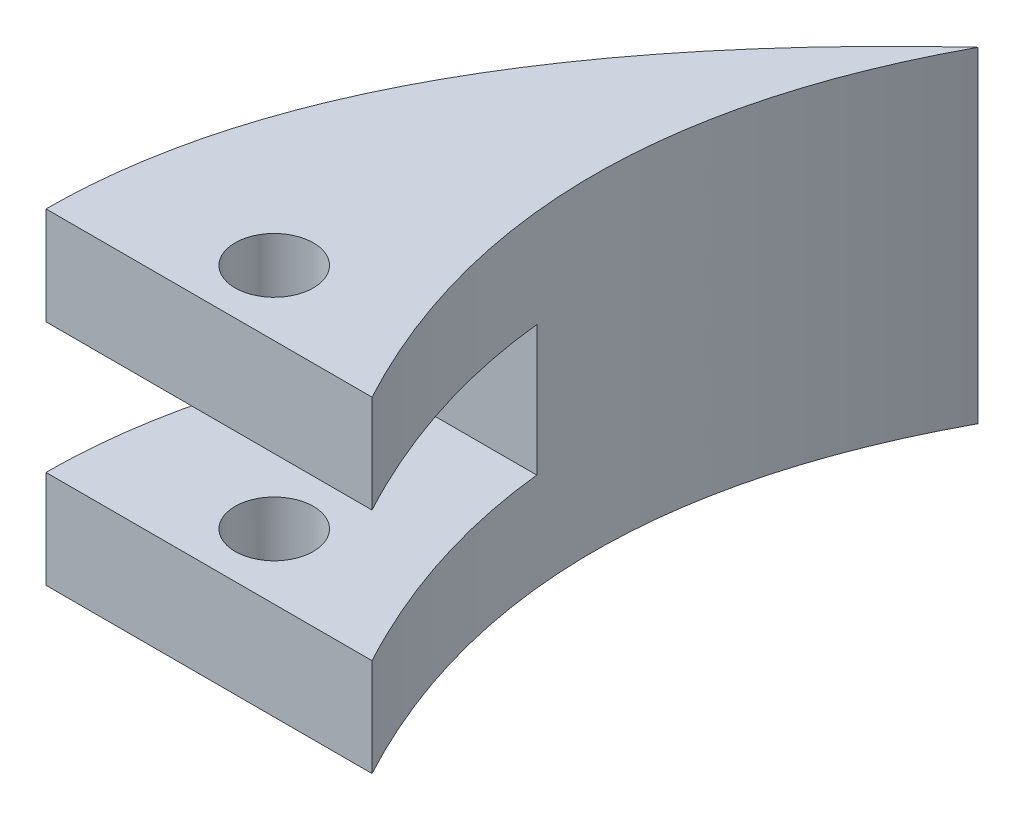
ISO-10303-21;
HEADER;
FILE_DESCRIPTION(('STEP AP214'),'2;1');
FILE_NAME('part.step','',(''),(''),'','','');
FILE_SCHEMA(('AUTOMOTIVE_DESIGN { 1 0 10303 214 1 1 1 1 }'));
ENDSEC;
DATA;
#1=APPLICATION_CONTEXT('core data for automotive mechanical design processes');
#2=APPLICATION_PROTOCOL_DEFINITION('international standard','automotive_design',2000,#1);
#3=PRODUCT_CONTEXT('',#1,'mechanical');
#4=PRODUCT('Part','Part','',(#3));
#5=PRODUCT_RELATED_PRODUCT_CATEGORY('part','',(#4));
#6=PRODUCT_DEFINITION_FORMATION('','',#4);
#7=PRODUCT_DEFINITION_CONTEXT('part definition',#1,'design');
#8=PRODUCT_DEFINITION('design','',#6,#7);
#9=PRODUCT_DEFINITION_SHAPE('','',#8);
#10=(LENGTH_UNIT() NAMED_UNIT(*) SI_UNIT(.MILLI.,.METRE.));
#11=(NAMED_UNIT(*) PLANE_ANGLE_UNIT() SI_UNIT($,.RADIAN.));
#12=(NAMED_UNIT(*) SI_UNIT($,.STERADIAN.) SOLID_ANGLE_UNIT());
#13=UNCERTAINTY_MEASURE_WITH_UNIT(LENGTH_MEASURE(1.E-05),#10,'distance_accuracy_value','');
#14=(GEOMETRIC_REPRESENTATION_CONTEXT(3) GLOBAL_UNCERTAINTY_ASSIGNED_CONTEXT((#13)) GLOBAL_UNIT_ASSIGNED_CONTEXT((#10,
#11,#12)) REPRESENTATION_CONTEXT('',''));
#15=CARTESIAN_POINT('',(0.,0.,0.));
#16=DIRECTION('',(0.,0.,1.));
#17=DIRECTION('',(1.,0.,0.));
#18=AXIS2_PLACEMENT_3D('',#15,#16,#17);
#19=CARTESIAN_POINT('',(-12.5,-12.5,46.469893974937));
#20=DIRECTION('',(0.,1.,0.));
#21=DIRECTION('',(0.,0.,1.));
#22=AXIS2_PLACEMENT_3D('',#19,#20,#21);
#23=PLANE('',#22);
#24=CARTESIAN_POINT('',(0.,-12.5,41.469893974937));
#25=DIRECTION('',(0.,1.,0.));
#26=DIRECTION('',(0.,0.,1.));
#27=AXIS2_PLACEMENT_3D('',#24,#25,#26);
#28=CIRCLE('',#27,3.);
#29=CARTESIAN_POINT('',(0.,-12.5,44.469893974937));
#30=VERTEX_POINT('',#29);
#31=EDGE_CURVE('E195',#30,#30,#28,.T.);
#32=ORIENTED_EDGE('',*,*,#31,.T.);
#33=EDGE_LOOP('',(#32));
#34=FACE_BOUND('',#33,.T.);
#35=CARTESIAN_POINT('',(12.5,-12.5,0.));
#36=CARTESIAN_POINT('',(-12.5,-12.5,23.2349469874685));
#37=CARTESIAN_POINT('',(-12.5,-12.5,46.469893974937));
#38=B_SPLINE_CURVE_WITH_KNOTS('',2,(#35,#36,#37),.UNSPECIFIED.,.F.,.F.,(3,3),(0.,1.),.UNSPECIFIED.);
#39=CARTESIAN_POINT('',(12.5,-12.5,0.));
#40=VERTEX_POINT('',#39);
#41=CARTESIAN_POINT('',(-12.5,-12.5,46.469893974937));
#42=VERTEX_POINT('',#41);
#43=EDGE_CURVE('E175',#40,#42,#38,.T.);
#44=ORIENTED_EDGE('',*,*,#43,.F.);
#45=CARTESIAN_POINT('',(12.5,-12.5,0.));
#46=CARTESIAN_POINT('',(0.,-12.5,23.2349469874685));
#47=CARTESIAN_POINT('',(12.5,-12.5,46.469893974937));
#48=B_SPLINE_CURVE_WITH_KNOTS('',2,(#45,#46,#47),.UNSPECIFIED.,.F.,.F.,(3,3),(0.,1.),.UNSPECIFIED.);
#49=CARTESIAN_POINT('',(12.5,-12.5,46.469893974937));
#50=VERTEX_POINT('',#49);
#51=EDGE_CURVE('E203',#40,#50,#48,.T.);
#52=ORIENTED_EDGE('',*,*,#51,.T.);
#53=DIRECTION('',(1.,0.,0.));
#54=VECTOR('',#53,1.);
#55=CARTESIAN_POINT('',(-12.5,-12.5,46.469893974937));
#56=LINE('',#55,#54);
#57=EDGE_CURVE('E158',#42,#50,#56,.T.);
#58=ORIENTED_EDGE('',*,*,#57,.F.);
#59=EDGE_LOOP('',(#44,#52,#58));
#60=FACE_BOUND('',#59,.T.);
#61=ADVANCED_FACE('F70',(#34,#60),#23,.F.);
#62=CARTESIAN_POINT('',(-12.5,12.5,46.469893974937));
#63=DIRECTION('',(0.,1.,0.));
#64=DIRECTION('',(0.,0.,1.));
#65=AXIS2_PLACEMENT_3D('',#62,#63,#64);
#66=PLANE('',#65);
#67=CARTESIAN_POINT('',(0.,12.5,41.469893974937));
#68=DIRECTION('',(0.,1.,0.));
#69=DIRECTION('',(0.,0.,1.));
#70=AXIS2_PLACEMENT_3D('',#67,#68,#69);
#71=CIRCLE('',#70,3.);
#72=CARTESIAN_POINT('',(0.,12.5,44.469893974937));
#73=VERTEX_POINT('',#72);
#74=EDGE_CURVE('E166',#73,#73,#71,.T.);
#75=ORIENTED_EDGE('',*,*,#74,.F.);
#76=EDGE_LOOP('',(#75));
#77=FACE_BOUND('',#76,.T.);
#78=CARTESIAN_POINT('',(12.5,12.5,0.));
#79=CARTESIAN_POINT('',(0.,12.5,23.2349469874685));
#80=CARTESIAN_POINT('',(12.5,12.5,46.469893974937));
#81=B_SPLINE_CURVE_WITH_KNOTS('',2,(#78,#79,#80),.UNSPECIFIED.,.F.,.F.,(3,3),(0.,1.),.UNSPECIFIED.);
#82=CARTESIAN_POINT('',(12.5,12.5,0.));
#83=VERTEX_POINT('',#82);
#84=CARTESIAN_POINT('',(12.5,12.5,46.469893974937));
#85=VERTEX_POINT('',#84);
#86=EDGE_CURVE('E129',#83,#85,#81,.T.);
#87=ORIENTED_EDGE('',*,*,#86,.F.);
#88=CARTESIAN_POINT('',(12.5,12.5,0.));
#89=CARTESIAN_POINT('',(-12.5,12.5,23.2349469874685));
#90=CARTESIAN_POINT('',(-12.5,12.5,46.469893974937));
#91=B_SPLINE_CURVE_WITH_KNOTS('',2,(#88,#89,#90),.UNSPECIFIED.,.F.,.F.,(3,3),(0.,1.),.UNSPECIFIED.);
#92=CARTESIAN_POINT('',(-12.5,12.5,46.469893974937));
#93=VERTEX_POINT('',#92);
#94=EDGE_CURVE('E139',#83,#93,#91,.T.);
#95=ORIENTED_EDGE('',*,*,#94,.T.);
#96=DIRECTION('',(1.,0.,0.));
#97=VECTOR('',#96,1.);
#98=CARTESIAN_POINT('',(-12.5,12.5,46.469893974937));
#99=LINE('',#98,#97);
#100=EDGE_CURVE('E146',#93,#85,#99,.T.);
#101=ORIENTED_EDGE('',*,*,#100,.T.);
#102=EDGE_LOOP('',(#87,#95,#101));
#103=FACE_BOUND('',#102,.T.);
#104=ADVANCED_FACE('F72',(#77,#103),#66,.T.);
#105=CARTESIAN_POINT('',(12.5,5.,27.8300591493384));
#106=DIRECTION('',(0.,1.,0.));
#107=DIRECTION('',(0.,0.,1.));
#108=AXIS2_PLACEMENT_3D('',#105,#106,#107);
#109=PLANE('',#108);
#110=CARTESIAN_POINT('',(0.,5.,41.469893974937));
#111=DIRECTION('',(0.,1.,0.));
#112=DIRECTION('',(0.,0.,1.));
#113=AXIS2_PLACEMENT_3D('',#110,#111,#112);
#114=CIRCLE('',#113,3.);
#115=CARTESIAN_POINT('',(0.,5.,44.469893974937));
#116=VERTEX_POINT('',#115);
#117=EDGE_CURVE('E162',#116,#116,#114,.F.);
#118=ORIENTED_EDGE('',*,*,#117,.F.);
#119=EDGE_LOOP('',(#118));
#120=FACE_BOUND('',#119,.T.);
#121=CARTESIAN_POINT('',(12.5,5.,0.));
#122=CARTESIAN_POINT('',(-12.5,5.,23.2349469874685));
#123=CARTESIAN_POINT('',(-12.5,5.,46.469893974937));
#124=B_SPLINE_CURVE_WITH_KNOTS('',2,(#121,#122,#123),.UNSPECIFIED.,.F.,.F.,(3,3),(0.,1.),.UNSPECIFIED.);
#125=CARTESIAN_POINT('',(-8.47764159828446,5.,27.8300591493384));
#126=VERTEX_POINT('',#125);
#127=CARTESIAN_POINT('',(-12.5,5.,46.469893974937));
#128=VERTEX_POINT('',#127);
#129=EDGE_CURVE('E200',#126,#128,#124,.T.);
#130=ORIENTED_EDGE('',*,*,#129,.F.);
#131=DIRECTION('',(-1.,0.,0.));
#132=VECTOR('',#131,1.);
#133=CARTESIAN_POINT('',(12.5,5.,27.8300591493384));
#134=LINE('',#133,#132);
#135=CARTESIAN_POINT('',(6.4944493453425,5.,27.8300591493384));
#136=VERTEX_POINT('',#135);
#137=EDGE_CURVE('E163',#136,#126,#134,.T.);
#138=ORIENTED_EDGE('',*,*,#137,.F.);
#139=CARTESIAN_POINT('',(12.5,5.,0.));
#140=CARTESIAN_POINT('',(0.,5.,23.2349469874685));
#141=CARTESIAN_POINT('',(12.5,5.,46.469893974937));
#142=B_SPLINE_CURVE_WITH_KNOTS('',2,(#139,#140,#141),.UNSPECIFIED.,.F.,.F.,(3,3),(0.,1.),.UNSPECIFIED.);
#143=CARTESIAN_POINT('',(12.5,5.,46.469893974937));
#144=VERTEX_POINT('',#143);
#145=EDGE_CURVE('E88',#136,#144,#142,.T.);
#146=ORIENTED_EDGE('',*,*,#145,.T.);
#147=DIRECTION('',(-1.,0.,0.));
#148=VECTOR('',#147,1.);
#149=CARTESIAN_POINT('',(12.5,5.,46.469893974937));
#150=LINE('',#149,#148);
#151=EDGE_CURVE('E148',#144,#128,#150,.T.);
#152=ORIENTED_EDGE('',*,*,#151,.T.);
#153=EDGE_LOOP('',(#130,#138,#146,#152));
#154=FACE_BOUND('',#153,.T.);
#155=ADVANCED_FACE('F273',(#120,#154),#109,.F.);
#156=CARTESIAN_POINT('',(12.5,-5.,27.8300591493384));
#157=DIRECTION('',(0.,-1.,0.));
#158=DIRECTION('',(0.,0.,-1.));
#159=AXIS2_PLACEMENT_3D('',#156,#157,#158);
#160=PLANE('',#159);
#161=CARTESIAN_POINT('',(0.,-5.,41.469893974937));
#162=DIRECTION('',(0.,-1.,0.));
#163=DIRECTION('',(0.,0.,-1.));
#164=AXIS2_PLACEMENT_3D('',#161,#162,#163);
#165=CIRCLE('',#164,3.);
#166=CARTESIAN_POINT('',(0.,-5.,38.469893974937));
#167=VERTEX_POINT('',#166);
#168=EDGE_CURVE('E159',#167,#167,#165,.F.);
#169=ORIENTED_EDGE('',*,*,#168,.F.);
#170=EDGE_LOOP('',(#169));
#171=FACE_BOUND('',#170,.T.);
#172=CARTESIAN_POINT('',(12.5,-5.,0.));
#173=CARTESIAN_POINT('',(-12.5,-5.,23.2349469874685));
#174=CARTESIAN_POINT('',(-12.5,-5.,46.469893974937));
#175=B_SPLINE_CURVE_WITH_KNOTS('',2,(#172,#173,#174),.UNSPECIFIED.,.F.,.F.,(3,3),(0.,1.),.UNSPECIFIED.);
#176=CARTESIAN_POINT('',(-12.5,-5.,46.469893974937));
#177=VERTEX_POINT('',#176);
#178=CARTESIAN_POINT('',(-8.47764159828446,-5.,27.8300591493384));
#179=VERTEX_POINT('',#178);
#180=EDGE_CURVE('E96',#177,#179,#175,.F.);
#181=ORIENTED_EDGE('',*,*,#180,.F.);
#182=DIRECTION('',(1.,0.,0.));
#183=VECTOR('',#182,1.);
#184=CARTESIAN_POINT('',(12.5,-5.,46.469893974937));
#185=LINE('',#184,#183);
#186=CARTESIAN_POINT('',(12.5,-5.,46.469893974937));
#187=VERTEX_POINT('',#186);
#188=EDGE_CURVE('E172',#177,#187,#185,.T.);
#189=ORIENTED_EDGE('',*,*,#188,.T.);
#190=CARTESIAN_POINT('',(12.5,-5.,0.));
#191=CARTESIAN_POINT('',(0.,-5.,23.2349469874685));
#192=CARTESIAN_POINT('',(12.5,-5.,46.469893974937));
#193=B_SPLINE_CURVE_WITH_KNOTS('',2,(#190,#191,#192),.UNSPECIFIED.,.F.,.F.,(3,3),(0.,1.),.UNSPECIFIED.);
#194=CARTESIAN_POINT('',(6.4944493453425,-5.,27.8300591493384));
#195=VERTEX_POINT('',#194);
#196=EDGE_CURVE('E230',#187,#195,#193,.F.);
#197=ORIENTED_EDGE('',*,*,#196,.T.);
#198=DIRECTION('',(1.,0.,0.));
#199=VECTOR('',#198,1.);
#200=CARTESIAN_POINT('',(12.5,-5.,27.8300591493384));
#201=LINE('',#200,#199);
#202=EDGE_CURVE('E178',#179,#195,#201,.T.);
#203=ORIENTED_EDGE('',*,*,#202,.F.);
#204=EDGE_LOOP('',(#181,#189,#197,#203));
#205=FACE_BOUND('',#204,.T.);
#206=ADVANCED_FACE('F272',(#171,#205),#160,.F.);
#207=CARTESIAN_POINT('',(0.,0.,27.8300591493384));
#208=DIRECTION('',(0.,0.,1.));
#209=DIRECTION('',(1.,0.,0.));
#210=AXIS2_PLACEMENT_3D('',#207,#208,#209);
#211=PLANE('',#210);
#212=ORIENTED_EDGE('',*,*,#137,.T.);
#213=DIRECTION('',(0.,1.,0.));
#214=VECTOR('',#213,1.);
#215=CARTESIAN_POINT('',(-8.47764159828446,-30.5,27.8300591493384));
#216=LINE('',#215,#214);
#217=EDGE_CURVE('E13',#126,#179,#216,.F.);
#218=ORIENTED_EDGE('',*,*,#217,.T.);
#219=ORIENTED_EDGE('',*,*,#202,.T.);
#220=DIRECTION('',(0.,1.,0.));
#221=VECTOR('',#220,1.);
#222=CARTESIAN_POINT('',(6.4944493453425,-30.5,27.8300591493384));
#223=LINE('',#222,#221);
#224=EDGE_CURVE('E80',#136,#195,#223,.F.);
#225=ORIENTED_EDGE('',*,*,#224,.F.);
#226=EDGE_LOOP('',(#212,#218,#219,#225));
#227=FACE_BOUND('',#226,.T.);
#228=ADVANCED_FACE('F269',(#227),#211,.T.);
#229=CARTESIAN_POINT('',(0.,0.,46.469893974937));
#230=DIRECTION('',(0.,0.,-1.));
#231=DIRECTION('',(-1.,0.,0.));
#232=AXIS2_PLACEMENT_3D('',#229,#230,#231);
#233=PLANE('',#232);
#234=DIRECTION('',(0.,1.,0.));
#235=VECTOR('',#234,1.);
#236=CARTESIAN_POINT('',(-12.5,-12.5,46.469893974937));
#237=LINE('',#236,#235);
#238=EDGE_CURVE('E74',#128,#93,#237,.T.);
#239=ORIENTED_EDGE('',*,*,#238,.F.);
#240=ORIENTED_EDGE('',*,*,#151,.F.);
#241=DIRECTION('',(0.,1.,0.));
#242=VECTOR('',#241,1.);
#243=CARTESIAN_POINT('',(12.5,-12.5,46.469893974937));
#244=LINE('',#243,#242);
#245=EDGE_CURVE('E132',#144,#85,#244,.T.);
#246=ORIENTED_EDGE('',*,*,#245,.T.);
#247=ORIENTED_EDGE('',*,*,#100,.F.);
#248=EDGE_LOOP('',(#239,#240,#246,#247));
#249=FACE_BOUND('',#248,.T.);
#250=ADVANCED_FACE('F145',(#249),#233,.F.);
#251=CARTESIAN_POINT('',(0.,-23.8445328510129,41.469893974937));
#252=DIRECTION('',(0.,1.,0.));
#253=DIRECTION('',(0.,0.,1.));
#254=AXIS2_PLACEMENT_3D('',#251,#252,#253);
#255=CYLINDRICAL_SURFACE('',#254,3.);
#256=ORIENTED_EDGE('',*,*,#117,.T.);
#257=EDGE_LOOP('',(#256));
#258=FACE_BOUND('',#257,.T.);
#259=ORIENTED_EDGE('',*,*,#74,.T.);
#260=EDGE_LOOP('',(#259));
#261=FACE_BOUND('',#260,.T.);
#262=ADVANCED_FACE('F284',(#258,#261),#255,.F.);
#263=EDGE_CURVE('E149',#50,#187,#244,.T.);
#264=ORIENTED_EDGE('',*,*,#263,.T.);
#265=ORIENTED_EDGE('',*,*,#188,.F.);
#266=EDGE_CURVE('E151',#42,#177,#237,.T.);
#267=ORIENTED_EDGE('',*,*,#266,.F.);
#268=ORIENTED_EDGE('',*,*,#57,.T.);
#269=EDGE_LOOP('',(#264,#265,#267,#268));
#270=FACE_BOUND('',#269,.T.);
#271=ADVANCED_FACE('F282',(#270),#233,.F.);
#272=ORIENTED_EDGE('',*,*,#168,.T.);
#273=EDGE_LOOP('',(#272));
#274=FACE_BOUND('',#273,.T.);
#275=ORIENTED_EDGE('',*,*,#31,.F.);
#276=EDGE_LOOP('',(#275));
#277=FACE_BOUND('',#276,.T.);
#278=ADVANCED_FACE('F268',(#274,#277),#255,.F.);
#279=CARTESIAN_POINT('',(12.5,-30.5,0.));
#280=CARTESIAN_POINT('',(-12.5,-30.5,23.2349469874685));
#281=CARTESIAN_POINT('',(-12.5,-30.5,46.469893974937));
#282=B_SPLINE_CURVE_WITH_KNOTS('',2,(#279,#280,#281),.UNSPECIFIED.,.F.,.F.,(3,3),(0.,1.),.UNSPECIFIED.);
#283=DIRECTION('',(0.,1.,0.));
#284=VECTOR('',#283,1.);
#285=SURFACE_OF_LINEAR_EXTRUSION('',#282,#284);
#286=ORIENTED_EDGE('',*,*,#43,.T.);
#287=ORIENTED_EDGE('',*,*,#266,.T.);
#288=ORIENTED_EDGE('',*,*,#180,.T.);
#289=ORIENTED_EDGE('',*,*,#217,.F.);
#290=ORIENTED_EDGE('',*,*,#129,.T.);
#291=ORIENTED_EDGE('',*,*,#238,.T.);
#292=ORIENTED_EDGE('',*,*,#94,.F.);
#293=DIRECTION('',(0.,1.,0.));
#294=VECTOR('',#293,1.);
#295=CARTESIAN_POINT('',(12.5,-30.5,0.));
#296=LINE('',#295,#294);
#297=EDGE_CURVE('E134',#40,#83,#296,.T.);
#298=ORIENTED_EDGE('',*,*,#297,.F.);
#299=EDGE_LOOP('',(#286,#287,#288,#289,#290,#291,#292,#298));
#300=FACE_BOUND('',#299,.T.);
#301=ADVANCED_FACE('F199',(#300),#285,.T.);
#302=CARTESIAN_POINT('',(12.5,-30.5,0.));
#303=CARTESIAN_POINT('',(0.,-30.5,23.2349469874685));
#304=CARTESIAN_POINT('',(12.5,-30.5,46.469893974937));
#305=B_SPLINE_CURVE_WITH_KNOTS('',2,(#302,#303,#304),.UNSPECIFIED.,.F.,.F.,(3,3),(0.,1.),.UNSPECIFIED.);
#306=DIRECTION('',(0.,1.,0.));
#307=VECTOR('',#306,1.);
#308=SURFACE_OF_LINEAR_EXTRUSION('',#305,#307);
#309=ORIENTED_EDGE('',*,*,#297,.T.);
#310=ORIENTED_EDGE('',*,*,#86,.T.);
#311=ORIENTED_EDGE('',*,*,#245,.F.);
#312=ORIENTED_EDGE('',*,*,#145,.F.);
#313=ORIENTED_EDGE('',*,*,#224,.T.);
#314=ORIENTED_EDGE('',*,*,#196,.F.);
#315=ORIENTED_EDGE('',*,*,#263,.F.);
#316=ORIENTED_EDGE('',*,*,#51,.F.);
#317=EDGE_LOOP('',(#309,#310,#311,#312,#313,#314,#315,#316));
#318=FACE_BOUND('',#317,.T.);
#319=ADVANCED_FACE('F131',(#318),#308,.F.);
#320=CLOSED_SHELL('',(#61,#104,#155,#206,#228,#250,#262,#271,#278,#301,#319));
#321=MANIFOLD_SOLID_BREP('B2',#320);
#322=ADVANCED_BREP_SHAPE_REPRESENTATION('',(#18,#321),#14);
#323=SHAPE_DEFINITION_REPRESENTATION(#9,#322);
ENDSEC;
END-ISO-10303-21;
